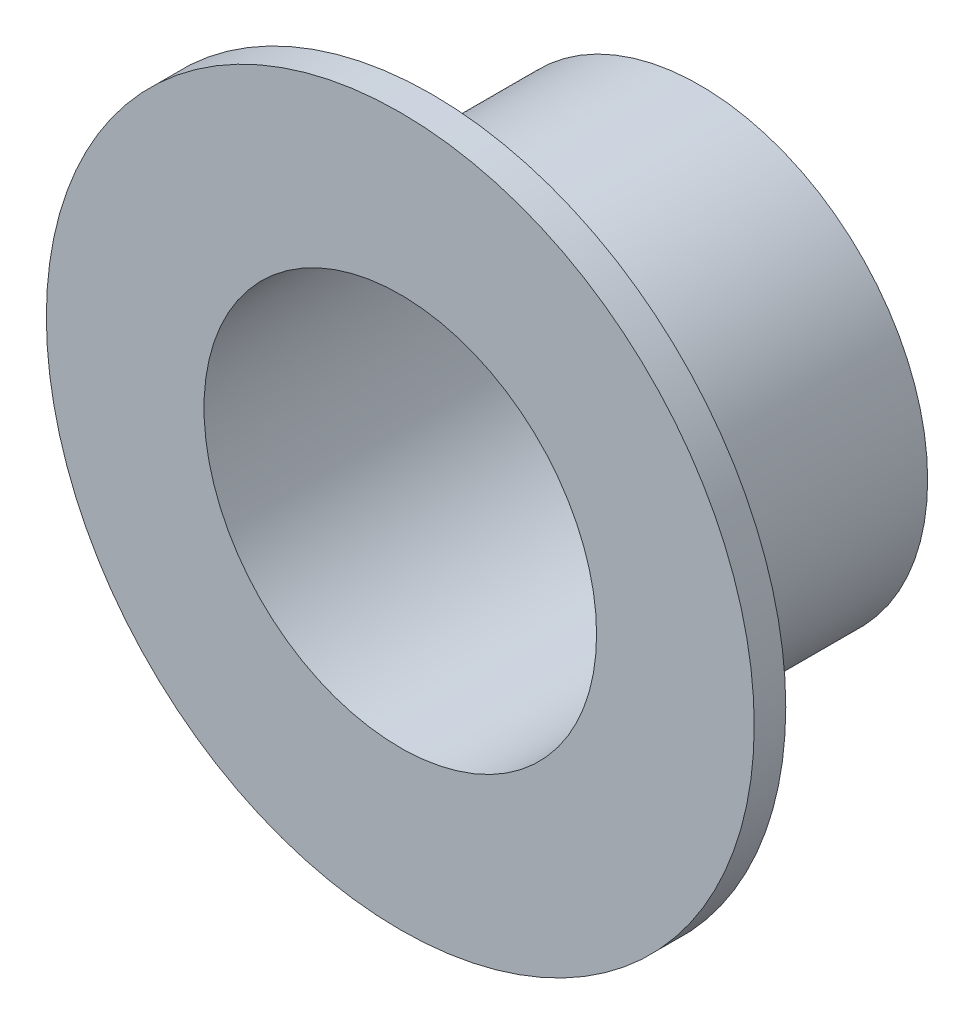
ISO-10303-21;
HEADER;
FILE_DESCRIPTION(('STEP AP214'),'2;1');
FILE_NAME('part.step','',(''),(''),'','','');
FILE_SCHEMA(('AUTOMOTIVE_DESIGN { 1 0 10303 214 1 1 1 1 }'));
ENDSEC;
DATA;
#1=APPLICATION_CONTEXT('core data for automotive mechanical design processes');
#2=APPLICATION_PROTOCOL_DEFINITION('international standard','automotive_design',2000,#1);
#3=PRODUCT_CONTEXT('',#1,'mechanical');
#4=PRODUCT('Part','Part','',(#3));
#5=PRODUCT_RELATED_PRODUCT_CATEGORY('part','',(#4));
#6=PRODUCT_DEFINITION_FORMATION('','',#4);
#7=PRODUCT_DEFINITION_CONTEXT('part definition',#1,'design');
#8=PRODUCT_DEFINITION('design','',#6,#7);
#9=PRODUCT_DEFINITION_SHAPE('','',#8);
#10=(LENGTH_UNIT() NAMED_UNIT(*) SI_UNIT(.MILLI.,.METRE.));
#11=(NAMED_UNIT(*) PLANE_ANGLE_UNIT() SI_UNIT($,.RADIAN.));
#12=(NAMED_UNIT(*) SI_UNIT($,.STERADIAN.) SOLID_ANGLE_UNIT());
#13=UNCERTAINTY_MEASURE_WITH_UNIT(LENGTH_MEASURE(1.E-05),#10,'distance_accuracy_value','');
#14=(GEOMETRIC_REPRESENTATION_CONTEXT(3) GLOBAL_UNCERTAINTY_ASSIGNED_CONTEXT((#13)) GLOBAL_UNIT_ASSIGNED_CONTEXT((#10,
#11,#12)) REPRESENTATION_CONTEXT('',''));
#15=CARTESIAN_POINT('',(0.,0.,0.));
#16=DIRECTION('',(0.,0.,1.));
#17=DIRECTION('',(1.,0.,0.));
#18=AXIS2_PLACEMENT_3D('',#15,#16,#17);
#19=CARTESIAN_POINT('',(420.000000000003,655.,37.0530531653856));
#20=DIRECTION('',(0.,0.,1.));
#21=DIRECTION('',(1.,0.,0.));
#22=AXIS2_PLACEMENT_3D('',#19,#20,#21);
#23=CYLINDRICAL_SURFACE('',#22,6.22547934031747);
#24=CARTESIAN_POINT('',(420.000000000003,655.,26.7691453664121));
#25=DIRECTION('',(0.,0.,1.));
#26=DIRECTION('',(1.,0.,0.));
#27=AXIS2_PLACEMENT_3D('',#24,#25,#26);
#28=CIRCLE('',#27,6.22547934031747);
#29=CARTESIAN_POINT('',(426.225479340321,655.,26.7691453664121));
#30=VERTEX_POINT('',#29);
#31=EDGE_CURVE('E10',#30,#30,#28,.T.);
#32=ORIENTED_EDGE('',*,*,#31,.F.);
#33=EDGE_LOOP('',(#32));
#34=FACE_BOUND('',#33,.T.);
#35=CARTESIAN_POINT('',(420.000000000003,655.,36.2691453664121));
#36=DIRECTION('',(0.,0.,1.));
#37=DIRECTION('',(1.,0.,0.));
#38=AXIS2_PLACEMENT_3D('',#35,#36,#37);
#39=CIRCLE('',#38,6.22547934031747);
#40=CARTESIAN_POINT('',(426.225479340321,655.,36.2691453664121));
#41=VERTEX_POINT('',#40);
#42=EDGE_CURVE('E54',#41,#41,#39,.T.);
#43=ORIENTED_EDGE('',*,*,#42,.T.);
#44=EDGE_LOOP('',(#43));
#45=FACE_BOUND('',#44,.T.);
#46=ADVANCED_FACE('F32',(#34,#45),#23,.F.);
#47=CARTESIAN_POINT('',(420.000000000003,661.225479340318,26.7691453664121));
#48=DIRECTION('',(0.,0.,1.));
#49=DIRECTION('',(1.,0.,0.));
#50=AXIS2_PLACEMENT_3D('',#47,#48,#49);
#51=PLANE('',#50);
#52=CARTESIAN_POINT('',(420.000000000003,655.,26.7691453664121));
#53=DIRECTION('',(0.,0.,1.));
#54=DIRECTION('',(1.,0.,0.));
#55=AXIS2_PLACEMENT_3D('',#52,#53,#54);
#56=CIRCLE('',#55,7.22547934031748);
#57=CARTESIAN_POINT('',(427.225479340321,655.,26.7691453664121));
#58=VERTEX_POINT('',#57);
#59=EDGE_CURVE('E38',#58,#58,#56,.T.);
#60=ORIENTED_EDGE('',*,*,#59,.F.);
#61=EDGE_LOOP('',(#60));
#62=FACE_BOUND('',#61,.T.);
#63=ORIENTED_EDGE('',*,*,#31,.T.);
#64=EDGE_LOOP('',(#63));
#65=FACE_BOUND('',#64,.T.);
#66=ADVANCED_FACE('F79',(#62,#65),#51,.F.);
#67=CARTESIAN_POINT('',(420.000000000003,655.,37.0530531653856));
#68=DIRECTION('',(0.,0.,1.));
#69=DIRECTION('',(1.,0.,0.));
#70=AXIS2_PLACEMENT_3D('',#67,#68,#69);
#71=CYLINDRICAL_SURFACE('',#70,7.22547934031748);
#72=CARTESIAN_POINT('',(420.000000000003,655.,35.2691453664121));
#73=DIRECTION('',(0.,0.,1.));
#74=DIRECTION('',(1.,0.,0.));
#75=AXIS2_PLACEMENT_3D('',#72,#73,#74);
#76=CIRCLE('',#75,7.22547934031748);
#77=CARTESIAN_POINT('',(427.225479340321,655.,35.2691453664121));
#78=VERTEX_POINT('',#77);
#79=EDGE_CURVE('E42',#78,#78,#76,.T.);
#80=ORIENTED_EDGE('',*,*,#79,.F.);
#81=EDGE_LOOP('',(#80));
#82=FACE_BOUND('',#81,.T.);
#83=ORIENTED_EDGE('',*,*,#59,.T.);
#84=EDGE_LOOP('',(#83));
#85=FACE_BOUND('',#84,.T.);
#86=ADVANCED_FACE('F74',(#82,#85),#71,.T.);
#87=CARTESIAN_POINT('',(420.000000000003,662.225479340318,35.2691453664121));
#88=DIRECTION('',(0.,0.,1.));
#89=DIRECTION('',(1.,0.,0.));
#90=AXIS2_PLACEMENT_3D('',#87,#88,#89);
#91=PLANE('',#90);
#92=CARTESIAN_POINT('',(420.000000000003,655.,35.2691453664121));
#93=DIRECTION('',(0.,0.,1.));
#94=DIRECTION('',(1.,0.,0.));
#95=AXIS2_PLACEMENT_3D('',#92,#93,#94);
#96=CIRCLE('',#95,11.2254793403175);
#97=CARTESIAN_POINT('',(431.225479340321,655.,35.2691453664121));
#98=VERTEX_POINT('',#97);
#99=EDGE_CURVE('E46',#98,#98,#96,.T.);
#100=ORIENTED_EDGE('',*,*,#99,.F.);
#101=EDGE_LOOP('',(#100));
#102=FACE_BOUND('',#101,.T.);
#103=ORIENTED_EDGE('',*,*,#79,.T.);
#104=EDGE_LOOP('',(#103));
#105=FACE_BOUND('',#104,.T.);
#106=ADVANCED_FACE('F68',(#102,#105),#91,.F.);
#107=CARTESIAN_POINT('',(420.000000000003,655.,37.0530531653856));
#108=DIRECTION('',(0.,0.,1.));
#109=DIRECTION('',(1.,0.,0.));
#110=AXIS2_PLACEMENT_3D('',#107,#108,#109);
#111=CYLINDRICAL_SURFACE('',#110,11.2254793403175);
#112=CARTESIAN_POINT('',(420.000000000003,655.,36.2691453664121));
#113=DIRECTION('',(0.,0.,1.));
#114=DIRECTION('',(1.,0.,0.));
#115=AXIS2_PLACEMENT_3D('',#112,#113,#114);
#116=CIRCLE('',#115,11.2254793403175);
#117=CARTESIAN_POINT('',(431.225479340321,655.,36.2691453664121));
#118=VERTEX_POINT('',#117);
#119=EDGE_CURVE('E51',#118,#118,#116,.T.);
#120=ORIENTED_EDGE('',*,*,#119,.F.);
#121=EDGE_LOOP('',(#120));
#122=FACE_BOUND('',#121,.T.);
#123=ORIENTED_EDGE('',*,*,#99,.T.);
#124=EDGE_LOOP('',(#123));
#125=FACE_BOUND('',#124,.T.);
#126=ADVANCED_FACE('F62',(#122,#125),#111,.T.);
#127=CARTESIAN_POINT('',(420.000000000003,666.225479340318,36.2691453664121));
#128=DIRECTION('',(0.,0.,-1.));
#129=DIRECTION('',(-1.,0.,0.));
#130=AXIS2_PLACEMENT_3D('',#127,#128,#129);
#131=PLANE('',#130);
#132=ORIENTED_EDGE('',*,*,#42,.F.);
#133=EDGE_LOOP('',(#132));
#134=FACE_BOUND('',#133,.T.);
#135=ORIENTED_EDGE('',*,*,#119,.T.);
#136=EDGE_LOOP('',(#135));
#137=FACE_BOUND('',#136,.T.);
#138=ADVANCED_FACE('F59',(#134,#137),#131,.F.);
#139=CLOSED_SHELL('',(#46,#66,#86,#106,#126,#138));
#140=MANIFOLD_SOLID_BREP('B2',#139);
#141=ADVANCED_BREP_SHAPE_REPRESENTATION('',(#18,#140),#14);
#142=SHAPE_DEFINITION_REPRESENTATION(#9,#141);
ENDSEC;
END-ISO-10303-21;
